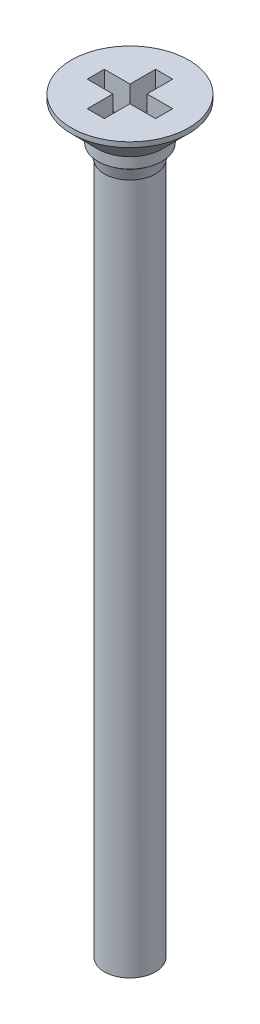
ISO-10303-21;
HEADER;
FILE_DESCRIPTION(('STEP AP214'),'2;1');
FILE_NAME('part.step','',(''),(''),'','','');
FILE_SCHEMA(('AUTOMOTIVE_DESIGN { 1 0 10303 214 1 1 1 1 }'));
ENDSEC;
DATA;
#1=APPLICATION_CONTEXT('core data for automotive mechanical design processes');
#2=APPLICATION_PROTOCOL_DEFINITION('international standard','automotive_design',2000,#1);
#3=PRODUCT_CONTEXT('',#1,'mechanical');
#4=PRODUCT('Part','Part','',(#3));
#5=PRODUCT_RELATED_PRODUCT_CATEGORY('part','',(#4));
#6=PRODUCT_DEFINITION_FORMATION('','',#4);
#7=PRODUCT_DEFINITION_CONTEXT('part definition',#1,'design');
#8=PRODUCT_DEFINITION('design','',#6,#7);
#9=PRODUCT_DEFINITION_SHAPE('','',#8);
#10=(LENGTH_UNIT() NAMED_UNIT(*) SI_UNIT(.MILLI.,.METRE.));
#11=(NAMED_UNIT(*) PLANE_ANGLE_UNIT() SI_UNIT($,.RADIAN.));
#12=(NAMED_UNIT(*) SI_UNIT($,.STERADIAN.) SOLID_ANGLE_UNIT());
#13=UNCERTAINTY_MEASURE_WITH_UNIT(LENGTH_MEASURE(1.E-05),#10,'distance_accuracy_value','');
#14=(GEOMETRIC_REPRESENTATION_CONTEXT(3) GLOBAL_UNCERTAINTY_ASSIGNED_CONTEXT((#13)) GLOBAL_UNIT_ASSIGNED_CONTEXT((#10,
#11,#12)) REPRESENTATION_CONTEXT('',''));
#15=CARTESIAN_POINT('',(0.,0.,0.));
#16=DIRECTION('',(0.,0.,1.));
#17=DIRECTION('',(1.,0.,0.));
#18=AXIS2_PLACEMENT_3D('',#15,#16,#17);
#19=CARTESIAN_POINT('',(0.,-2.65,-0.4));
#20=DIRECTION('',(0.,0.,-1.));
#21=DIRECTION('',(-1.,0.,0.));
#22=AXIS2_PLACEMENT_3D('',#19,#20,#21);
#23=PLANE('',#22);
#24=DIRECTION('',(0.,1.,0.));
#25=VECTOR('',#24,1.);
#26=CARTESIAN_POINT('',(0.4,-2.65,-0.4));
#27=LINE('',#26,#25);
#28=CARTESIAN_POINT('',(0.4,-2.1,-0.4));
#29=VERTEX_POINT('',#28);
#30=CARTESIAN_POINT('',(0.4,0.,-0.4));
#31=VERTEX_POINT('',#30);
#32=EDGE_CURVE('E215',#29,#31,#27,.T.);
#33=ORIENTED_EDGE('',*,*,#32,.F.);
#34=DIRECTION('',(1.,0.,0.));
#35=VECTOR('',#34,1.);
#36=CARTESIAN_POINT('',(-0.550000000000002,-2.1,-0.4));
#37=LINE('',#36,#35);
#38=CARTESIAN_POINT('',(0.550000000000002,-2.1,-0.4));
#39=VERTEX_POINT('',#38);
#40=EDGE_CURVE('E250',#29,#39,#37,.T.);
#41=ORIENTED_EDGE('',*,*,#40,.T.);
#42=DIRECTION('',(0.707106781186546,0.707106781186548,0.));
#43=VECTOR('',#42,1.);
#44=CARTESIAN_POINT('',(1.6,-1.05,-0.4));
#45=LINE('',#44,#43);
#46=CARTESIAN_POINT('',(1.6,-1.05,-0.4));
#47=VERTEX_POINT('',#46);
#48=EDGE_CURVE('E254',#39,#47,#45,.T.);
#49=ORIENTED_EDGE('',*,*,#48,.T.);
#50=DIRECTION('',(0.,1.,0.));
#51=VECTOR('',#50,1.);
#52=CARTESIAN_POINT('',(1.6,0.,-0.4));
#53=LINE('',#52,#51);
#54=CARTESIAN_POINT('',(1.6,0.,-0.4));
#55=VERTEX_POINT('',#54);
#56=EDGE_CURVE('E257',#47,#55,#53,.T.);
#57=ORIENTED_EDGE('',*,*,#56,.T.);
#58=DIRECTION('',(-1.,0.,0.));
#59=VECTOR('',#58,1.);
#60=CARTESIAN_POINT('',(1.6,0.,-0.4));
#61=LINE('',#60,#59);
#62=EDGE_CURVE('E261',#55,#31,#61,.T.);
#63=ORIENTED_EDGE('',*,*,#62,.T.);
#64=EDGE_LOOP('',(#33,#41,#49,#57,#63));
#65=FACE_BOUND('',#64,.T.);
#66=ADVANCED_FACE('F50',(#65),#23,.F.);
#67=CARTESIAN_POINT('',(0.,-2.65,0.4));
#68=DIRECTION('',(0.,0.,-1.));
#69=DIRECTION('',(-1.,0.,0.));
#70=AXIS2_PLACEMENT_3D('',#67,#68,#69);
#71=PLANE('',#70);
#72=DIRECTION('',(1.,0.,0.));
#73=VECTOR('',#72,1.);
#74=CARTESIAN_POINT('',(-0.550000000000002,-2.1,0.4));
#75=LINE('',#74,#73);
#76=CARTESIAN_POINT('',(0.4,-2.1,0.4));
#77=VERTEX_POINT('',#76);
#78=CARTESIAN_POINT('',(0.550000000000002,-2.1,0.4));
#79=VERTEX_POINT('',#78);
#80=EDGE_CURVE('E232',#77,#79,#75,.T.);
#81=ORIENTED_EDGE('',*,*,#80,.F.);
#82=DIRECTION('',(0.,1.,0.));
#83=VECTOR('',#82,1.);
#84=CARTESIAN_POINT('',(0.4,-2.65,0.4));
#85=LINE('',#84,#83);
#86=CARTESIAN_POINT('',(0.4,0.,0.4));
#87=VERTEX_POINT('',#86);
#88=EDGE_CURVE('E58',#77,#87,#85,.T.);
#89=ORIENTED_EDGE('',*,*,#88,.T.);
#90=DIRECTION('',(-1.,0.,0.));
#91=VECTOR('',#90,1.);
#92=CARTESIAN_POINT('',(1.6,0.,0.4));
#93=LINE('',#92,#91);
#94=CARTESIAN_POINT('',(1.6,0.,0.4));
#95=VERTEX_POINT('',#94);
#96=EDGE_CURVE('E241',#95,#87,#93,.T.);
#97=ORIENTED_EDGE('',*,*,#96,.F.);
#98=DIRECTION('',(0.,1.,0.));
#99=VECTOR('',#98,1.);
#100=CARTESIAN_POINT('',(1.6,0.,0.4));
#101=LINE('',#100,#99);
#102=CARTESIAN_POINT('',(1.6,-1.05,0.4));
#103=VERTEX_POINT('',#102);
#104=EDGE_CURVE('E238',#103,#95,#101,.T.);
#105=ORIENTED_EDGE('',*,*,#104,.F.);
#106=DIRECTION('',(0.707106781186546,0.707106781186548,0.));
#107=VECTOR('',#106,1.);
#108=CARTESIAN_POINT('',(1.6,-1.05,0.4));
#109=LINE('',#108,#107);
#110=EDGE_CURVE('E235',#79,#103,#109,.T.);
#111=ORIENTED_EDGE('',*,*,#110,.F.);
#112=EDGE_LOOP('',(#81,#89,#97,#105,#111));
#113=FACE_BOUND('',#112,.T.);
#114=ADVANCED_FACE('F304',(#113),#71,.T.);
#115=CARTESIAN_POINT('',(0.,0.,0.));
#116=DIRECTION('',(0.,-1.,0.));
#117=DIRECTION('',(1.,0.,0.));
#118=AXIS2_PLACEMENT_3D('',#115,#116,#117);
#119=PLANE('',#118);
#120=DIRECTION('',(1.,0.,0.));
#121=VECTOR('',#120,1.);
#122=CARTESIAN_POINT('',(-0.4,0.,1.6));
#123=LINE('',#122,#121);
#124=CARTESIAN_POINT('',(-0.4,0.,1.6));
#125=VERTEX_POINT('',#124);
#126=CARTESIAN_POINT('',(0.4,0.,1.6));
#127=VERTEX_POINT('',#126);
#128=EDGE_CURVE('E216',#125,#127,#123,.T.);
#129=ORIENTED_EDGE('',*,*,#128,.F.);
#130=DIRECTION('',(0.,0.,1.));
#131=VECTOR('',#130,1.);
#132=CARTESIAN_POINT('',(-0.4,0.,-1.6));
#133=LINE('',#132,#131);
#134=CARTESIAN_POINT('',(-0.4,0.,0.399999999999999));
#135=VERTEX_POINT('',#134);
#136=EDGE_CURVE('E209',#135,#125,#133,.T.);
#137=ORIENTED_EDGE('',*,*,#136,.F.);
#138=CARTESIAN_POINT('',(-1.6,0.,0.4));
#139=VERTEX_POINT('',#138);
#140=EDGE_CURVE('E240',#135,#139,#93,.T.);
#141=ORIENTED_EDGE('',*,*,#140,.T.);
#142=DIRECTION('',(0.,0.,1.));
#143=VECTOR('',#142,1.);
#144=CARTESIAN_POINT('',(-1.6,0.,-0.4));
#145=LINE('',#144,#143);
#146=CARTESIAN_POINT('',(-1.6,0.,-0.4));
#147=VERTEX_POINT('',#146);
#148=EDGE_CURVE('E271',#147,#139,#145,.T.);
#149=ORIENTED_EDGE('',*,*,#148,.F.);
#150=CARTESIAN_POINT('',(-0.4,0.,-0.4));
#151=VERTEX_POINT('',#150);
#152=EDGE_CURVE('E260',#151,#147,#61,.T.);
#153=ORIENTED_EDGE('',*,*,#152,.F.);
#154=CARTESIAN_POINT('',(-0.4,0.,-1.6));
#155=VERTEX_POINT('',#154);
#156=EDGE_CURVE('E210',#155,#151,#133,.T.);
#157=ORIENTED_EDGE('',*,*,#156,.F.);
#158=DIRECTION('',(1.,0.,0.));
#159=VECTOR('',#158,1.);
#160=CARTESIAN_POINT('',(-0.4,0.,-1.6));
#161=LINE('',#160,#159);
#162=CARTESIAN_POINT('',(0.4,0.,-1.6));
#163=VERTEX_POINT('',#162);
#164=EDGE_CURVE('E218',#155,#163,#161,.T.);
#165=ORIENTED_EDGE('',*,*,#164,.T.);
#166=DIRECTION('',(0.,0.,1.));
#167=VECTOR('',#166,1.);
#168=CARTESIAN_POINT('',(0.4,0.,-1.6));
#169=LINE('',#168,#167);
#170=EDGE_CURVE('E194',#163,#31,#169,.T.);
#171=ORIENTED_EDGE('',*,*,#170,.T.);
#172=ORIENTED_EDGE('',*,*,#62,.F.);
#173=DIRECTION('',(0.,0.,1.));
#174=VECTOR('',#173,1.);
#175=CARTESIAN_POINT('',(1.6,0.,-0.4));
#176=LINE('',#175,#174);
#177=EDGE_CURVE('E274',#55,#95,#176,.T.);
#178=ORIENTED_EDGE('',*,*,#177,.T.);
#179=ORIENTED_EDGE('',*,*,#96,.T.);
#180=EDGE_CURVE('E73',#87,#127,#169,.T.);
#181=ORIENTED_EDGE('',*,*,#180,.T.);
#182=EDGE_LOOP('',(#129,#137,#141,#149,#153,#157,#165,#171,#172,#178,#179,#181));
#183=FACE_BOUND('',#182,.T.);
#184=CARTESIAN_POINT('',(0.,0.,0.));
#185=DIRECTION('',(0.,1.,0.));
#186=DIRECTION('',(-1.,0.,0.));
#187=AXIS2_PLACEMENT_3D('',#184,#185,#186);
#188=CIRCLE('',#187,2.75);
#189=CARTESIAN_POINT('',(-2.75,0.,0.));
#190=VERTEX_POINT('',#189);
#191=EDGE_CURVE('E300',#190,#190,#188,.T.);
#192=ORIENTED_EDGE('',*,*,#191,.T.);
#193=EDGE_LOOP('',(#192));
#194=FACE_BOUND('',#193,.T.);
#195=ADVANCED_FACE('F52',(#183,#194),#119,.F.);
#196=CARTESIAN_POINT('',(0.,0.,0.));
#197=DIRECTION('',(0.,1.,0.));
#198=DIRECTION('',(-1.,0.,0.));
#199=AXIS2_PLACEMENT_3D('',#196,#197,#198);
#200=CYLINDRICAL_SURFACE('',#199,2.75);
#201=ORIENTED_EDGE('',*,*,#191,.F.);
#202=EDGE_LOOP('',(#201));
#203=FACE_BOUND('',#202,.T.);
#204=CARTESIAN_POINT('',(0.,-0.237500000000007,0.));
#205=DIRECTION('',(0.,1.,0.));
#206=DIRECTION('',(-1.,0.,0.));
#207=AXIS2_PLACEMENT_3D('',#204,#205,#206);
#208=CIRCLE('',#207,2.75);
#209=CARTESIAN_POINT('',(-2.75,-0.237500000000007,0.));
#210=VERTEX_POINT('',#209);
#211=EDGE_CURVE('E297',#210,#210,#208,.T.);
#212=ORIENTED_EDGE('',*,*,#211,.T.);
#213=EDGE_LOOP('',(#212));
#214=FACE_BOUND('',#213,.T.);
#215=ADVANCED_FACE('F409',(#203,#214),#200,.T.);
#216=CARTESIAN_POINT('',(0.,-1.4875,0.));
#217=DIRECTION('',(0.,1.,0.));
#218=DIRECTION('',(-1.,0.,0.));
#219=AXIS2_PLACEMENT_3D('',#216,#217,#218);
#220=CONICAL_SURFACE('',#219,1.5,0.78539816339745);
#221=ORIENTED_EDGE('',*,*,#211,.F.);
#222=EDGE_LOOP('',(#221));
#223=FACE_BOUND('',#222,.T.);
#224=CARTESIAN_POINT('',(0.,-1.4875,0.));
#225=DIRECTION('',(0.,1.,0.));
#226=DIRECTION('',(-1.,0.,0.));
#227=AXIS2_PLACEMENT_3D('',#224,#225,#226);
#228=CIRCLE('',#227,1.5);
#229=CARTESIAN_POINT('',(-1.5,-1.4875,0.));
#230=VERTEX_POINT('',#229);
#231=EDGE_CURVE('E294',#230,#230,#228,.T.);
#232=ORIENTED_EDGE('',*,*,#231,.T.);
#233=EDGE_LOOP('',(#232));
#234=FACE_BOUND('',#233,.T.);
#235=ADVANCED_FACE('F406',(#223,#234),#220,.T.);
#236=CARTESIAN_POINT('',(0.,0.,0.));
#237=DIRECTION('',(0.,1.,0.));
#238=DIRECTION('',(-1.,0.,0.));
#239=AXIS2_PLACEMENT_3D('',#236,#237,#238);
#240=CYLINDRICAL_SURFACE('',#239,1.5);
#241=ORIENTED_EDGE('',*,*,#231,.F.);
#242=EDGE_LOOP('',(#241));
#243=FACE_BOUND('',#242,.T.);
#244=CARTESIAN_POINT('',(0.,-1.9875,0.));
#245=DIRECTION('',(0.,1.,0.));
#246=DIRECTION('',(-1.,0.,0.));
#247=AXIS2_PLACEMENT_3D('',#244,#245,#246);
#248=CIRCLE('',#247,1.5);
#249=CARTESIAN_POINT('',(-1.5,-1.9875,0.));
#250=VERTEX_POINT('',#249);
#251=EDGE_CURVE('E291',#250,#250,#248,.T.);
#252=ORIENTED_EDGE('',*,*,#251,.T.);
#253=EDGE_LOOP('',(#252));
#254=FACE_BOUND('',#253,.T.);
#255=ADVANCED_FACE('F402',(#243,#254),#240,.T.);
#256=CARTESIAN_POINT('',(1.5,-1.9875,0.));
#257=DIRECTION('',(0.,1.,0.));
#258=DIRECTION('',(-1.,0.,0.));
#259=AXIS2_PLACEMENT_3D('',#256,#257,#258);
#260=PLANE('',#259);
#261=ORIENTED_EDGE('',*,*,#251,.F.);
#262=EDGE_LOOP('',(#261));
#263=FACE_BOUND('',#262,.T.);
#264=CARTESIAN_POINT('',(0.,-1.9875,0.));
#265=DIRECTION('',(0.,1.,0.));
#266=DIRECTION('',(-1.,0.,0.));
#267=AXIS2_PLACEMENT_3D('',#264,#265,#266);
#268=CIRCLE('',#267,1.3375);
#269=CARTESIAN_POINT('',(-1.3375,-1.9875,0.));
#270=VERTEX_POINT('',#269);
#271=EDGE_CURVE('E288',#270,#270,#268,.T.);
#272=ORIENTED_EDGE('',*,*,#271,.T.);
#273=EDGE_LOOP('',(#272));
#274=FACE_BOUND('',#273,.T.);
#275=ADVANCED_FACE('F398',(#263,#274),#260,.F.);
#276=CARTESIAN_POINT('',(0.,0.,0.));
#277=DIRECTION('',(0.,1.,0.));
#278=DIRECTION('',(-1.,0.,0.));
#279=AXIS2_PLACEMENT_3D('',#276,#277,#278);
#280=CYLINDRICAL_SURFACE('',#279,1.3375);
#281=ORIENTED_EDGE('',*,*,#271,.F.);
#282=EDGE_LOOP('',(#281));
#283=FACE_BOUND('',#282,.T.);
#284=CARTESIAN_POINT('',(0.,-2.11258468371008,0.));
#285=DIRECTION('',(0.,1.,0.));
#286=DIRECTION('',(-1.,0.,0.));
#287=AXIS2_PLACEMENT_3D('',#284,#285,#286);
#288=CIRCLE('',#287,1.3375);
#289=CARTESIAN_POINT('',(-1.3375,-2.11258468371008,0.));
#290=VERTEX_POINT('',#289);
#291=EDGE_CURVE('E285',#290,#290,#288,.T.);
#292=ORIENTED_EDGE('',*,*,#291,.T.);
#293=EDGE_LOOP('',(#292));
#294=FACE_BOUND('',#293,.T.);
#295=ADVANCED_FACE('F394',(#283,#294),#280,.T.);
#296=CARTESIAN_POINT('',(0.,-2.65,0.));
#297=DIRECTION('',(0.,1.,0.));
#298=DIRECTION('',(-1.,0.,0.));
#299=AXIS2_PLACEMENT_3D('',#296,#297,#298);
#300=CONICAL_SURFACE('',#299,1.1935,0.26179938779915);
#301=ORIENTED_EDGE('',*,*,#291,.F.);
#302=EDGE_LOOP('',(#301));
#303=FACE_BOUND('',#302,.T.);
#304=CARTESIAN_POINT('',(0.,-2.65,0.));
#305=DIRECTION('',(0.,1.,0.));
#306=DIRECTION('',(-1.,0.,0.));
#307=AXIS2_PLACEMENT_3D('',#304,#305,#306);
#308=CIRCLE('',#307,1.1935);
#309=CARTESIAN_POINT('',(-1.1935,-2.65,0.));
#310=VERTEX_POINT('',#309);
#311=EDGE_CURVE('E270',#310,#310,#308,.T.);
#312=ORIENTED_EDGE('',*,*,#311,.T.);
#313=EDGE_LOOP('',(#312));
#314=FACE_BOUND('',#313,.T.);
#315=ADVANCED_FACE('F390',(#303,#314),#300,.T.);
#316=CARTESIAN_POINT('',(0.,0.,0.));
#317=DIRECTION('',(0.,1.,0.));
#318=DIRECTION('',(-1.,0.,0.));
#319=AXIS2_PLACEMENT_3D('',#316,#317,#318);
#320=CYLINDRICAL_SURFACE('',#319,1.1935);
#321=ORIENTED_EDGE('',*,*,#311,.F.);
#322=EDGE_LOOP('',(#321));
#323=FACE_BOUND('',#322,.T.);
#324=CARTESIAN_POINT('',(0.,-35.,0.));
#325=DIRECTION('',(0.,-1.,0.));
#326=DIRECTION('',(1.,0.,0.));
#327=AXIS2_PLACEMENT_3D('',#324,#325,#326);
#328=CIRCLE('',#327,1.1935);
#329=CARTESIAN_POINT('',(1.1935,-35.,0.));
#330=VERTEX_POINT('',#329);
#331=EDGE_CURVE('E185',#330,#330,#328,.T.);
#332=ORIENTED_EDGE('',*,*,#331,.F.);
#333=EDGE_LOOP('',(#332));
#334=FACE_BOUND('',#333,.T.);
#335=ADVANCED_FACE('F387',(#323,#334),#320,.T.);
#336=CARTESIAN_POINT('',(-1.6,-1.05,-0.4));
#337=DIRECTION('',(-0.707106781186548,-0.707106781186546,0.));
#338=DIRECTION('',(0.707106781186547,-0.707106781186548,0.));
#339=AXIS2_PLACEMENT_3D('',#336,#337,#338);
#340=PLANE('',#339);
#341=DIRECTION('',(0.,0.,1.));
#342=VECTOR('',#341,1.);
#343=CARTESIAN_POINT('',(-0.550000000000002,-2.1,-0.4));
#344=LINE('',#343,#342);
#345=CARTESIAN_POINT('',(-0.550000000000002,-2.1,-0.4));
#346=VERTEX_POINT('',#345);
#347=CARTESIAN_POINT('',(-0.550000000000002,-2.1,0.4));
#348=VERTEX_POINT('',#347);
#349=EDGE_CURVE('E267',#346,#348,#344,.T.);
#350=ORIENTED_EDGE('',*,*,#349,.F.);
#351=DIRECTION('',(0.707106781186546,-0.707106781186548,0.));
#352=VECTOR('',#351,1.);
#353=CARTESIAN_POINT('',(-1.6,-1.05,-0.4));
#354=LINE('',#353,#352);
#355=CARTESIAN_POINT('',(-1.6,-1.05,-0.4));
#356=VERTEX_POINT('',#355);
#357=EDGE_CURVE('E247',#356,#346,#354,.T.);
#358=ORIENTED_EDGE('',*,*,#357,.F.);
#359=DIRECTION('',(0.,0.,1.));
#360=VECTOR('',#359,1.);
#361=CARTESIAN_POINT('',(-1.6,-1.05,-0.4));
#362=LINE('',#361,#360);
#363=CARTESIAN_POINT('',(-1.6,-1.05,0.4));
#364=VERTEX_POINT('',#363);
#365=EDGE_CURVE('E268',#356,#364,#362,.T.);
#366=ORIENTED_EDGE('',*,*,#365,.T.);
#367=DIRECTION('',(0.707106781186546,-0.707106781186548,0.));
#368=VECTOR('',#367,1.);
#369=CARTESIAN_POINT('',(-1.6,-1.05,0.4));
#370=LINE('',#369,#368);
#371=EDGE_CURVE('E229',#364,#348,#370,.T.);
#372=ORIENTED_EDGE('',*,*,#371,.T.);
#373=EDGE_LOOP('',(#350,#358,#366,#372));
#374=FACE_BOUND('',#373,.T.);
#375=ADVANCED_FACE('F341',(#374),#340,.F.);
#376=CARTESIAN_POINT('',(-1.6,0.,-0.4));
#377=DIRECTION('',(-1.,0.,0.));
#378=DIRECTION('',(0.,0.,1.));
#379=AXIS2_PLACEMENT_3D('',#376,#377,#378);
#380=PLANE('',#379);
#381=ORIENTED_EDGE('',*,*,#365,.F.);
#382=DIRECTION('',(0.,-1.,0.));
#383=VECTOR('',#382,1.);
#384=CARTESIAN_POINT('',(-1.6,0.,-0.4));
#385=LINE('',#384,#383);
#386=EDGE_CURVE('E264',#147,#356,#385,.T.);
#387=ORIENTED_EDGE('',*,*,#386,.F.);
#388=ORIENTED_EDGE('',*,*,#148,.T.);
#389=DIRECTION('',(0.,-1.,0.));
#390=VECTOR('',#389,1.);
#391=CARTESIAN_POINT('',(-1.6,0.,0.4));
#392=LINE('',#391,#390);
#393=EDGE_CURVE('E244',#139,#364,#392,.T.);
#394=ORIENTED_EDGE('',*,*,#393,.T.);
#395=EDGE_LOOP('',(#381,#387,#388,#394));
#396=FACE_BOUND('',#395,.T.);
#397=ADVANCED_FACE('F386',(#396),#380,.F.);
#398=CARTESIAN_POINT('',(1.6,0.,-0.4));
#399=DIRECTION('',(1.,0.,0.));
#400=DIRECTION('',(0.,0.,-1.));
#401=AXIS2_PLACEMENT_3D('',#398,#399,#400);
#402=PLANE('',#401);
#403=ORIENTED_EDGE('',*,*,#177,.F.);
#404=ORIENTED_EDGE('',*,*,#56,.F.);
#405=DIRECTION('',(0.,0.,1.));
#406=VECTOR('',#405,1.);
#407=CARTESIAN_POINT('',(1.6,-1.05,-0.4));
#408=LINE('',#407,#406);
#409=EDGE_CURVE('E277',#47,#103,#408,.T.);
#410=ORIENTED_EDGE('',*,*,#409,.T.);
#411=ORIENTED_EDGE('',*,*,#104,.T.);
#412=EDGE_LOOP('',(#403,#404,#410,#411));
#413=FACE_BOUND('',#412,.T.);
#414=ADVANCED_FACE('F313',(#413),#402,.F.);
#415=CARTESIAN_POINT('',(1.6,-1.05,-0.4));
#416=DIRECTION('',(0.707106781186548,-0.707106781186546,0.));
#417=DIRECTION('',(0.707106781186547,0.707106781186548,0.));
#418=AXIS2_PLACEMENT_3D('',#415,#416,#417);
#419=PLANE('',#418);
#420=ORIENTED_EDGE('',*,*,#409,.F.);
#421=ORIENTED_EDGE('',*,*,#48,.F.);
#422=DIRECTION('',(0.,0.,1.));
#423=VECTOR('',#422,1.);
#424=CARTESIAN_POINT('',(0.550000000000002,-2.1,-0.4));
#425=LINE('',#424,#423);
#426=EDGE_CURVE('E279',#39,#79,#425,.T.);
#427=ORIENTED_EDGE('',*,*,#426,.T.);
#428=ORIENTED_EDGE('',*,*,#110,.T.);
#429=EDGE_LOOP('',(#420,#421,#427,#428));
#430=FACE_BOUND('',#429,.T.);
#431=ADVANCED_FACE('F319',(#430),#419,.F.);
#432=CARTESIAN_POINT('',(-0.550000000000002,-2.1,-0.4));
#433=DIRECTION('',(0.,-1.,0.));
#434=DIRECTION('',(0.,0.,-1.));
#435=AXIS2_PLACEMENT_3D('',#432,#433,#434);
#436=PLANE('',#435);
#437=CARTESIAN_POINT('',(-0.4,-2.1,0.4));
#438=VERTEX_POINT('',#437);
#439=EDGE_CURVE('E233',#348,#438,#75,.T.);
#440=ORIENTED_EDGE('',*,*,#439,.T.);
#441=DIRECTION('',(0.,0.,-1.));
#442=VECTOR('',#441,1.);
#443=CARTESIAN_POINT('',(-0.4,-2.1,0.550000000000002));
#444=LINE('',#443,#442);
#445=CARTESIAN_POINT('',(-0.4,-2.1,0.550000000000002));
#446=VERTEX_POINT('',#445);
#447=EDGE_CURVE('E169',#446,#438,#444,.T.);
#448=ORIENTED_EDGE('',*,*,#447,.F.);
#449=DIRECTION('',(1.,0.,0.));
#450=VECTOR('',#449,1.);
#451=CARTESIAN_POINT('',(-0.4,-2.1,0.550000000000002));
#452=LINE('',#451,#450);
#453=CARTESIAN_POINT('',(0.4,-2.1,0.550000000000002));
#454=VERTEX_POINT('',#453);
#455=EDGE_CURVE('E163',#446,#454,#452,.T.);
#456=ORIENTED_EDGE('',*,*,#455,.T.);
#457=DIRECTION('',(0.,0.,-1.));
#458=VECTOR('',#457,1.);
#459=CARTESIAN_POINT('',(0.4,-2.1,0.550000000000002));
#460=LINE('',#459,#458);
#461=EDGE_CURVE('E167',#454,#77,#460,.T.);
#462=ORIENTED_EDGE('',*,*,#461,.T.);
#463=ORIENTED_EDGE('',*,*,#80,.T.);
#464=ORIENTED_EDGE('',*,*,#426,.F.);
#465=ORIENTED_EDGE('',*,*,#40,.F.);
#466=CARTESIAN_POINT('',(0.4,-2.1,-0.550000000000002));
#467=VERTEX_POINT('',#466);
#468=EDGE_CURVE('E65',#29,#467,#460,.T.);
#469=ORIENTED_EDGE('',*,*,#468,.T.);
#470=DIRECTION('',(1.,0.,0.));
#471=VECTOR('',#470,1.);
#472=CARTESIAN_POINT('',(-0.4,-2.1,-0.550000000000002));
#473=LINE('',#472,#471);
#474=CARTESIAN_POINT('',(-0.4,-2.1,-0.550000000000002));
#475=VERTEX_POINT('',#474);
#476=EDGE_CURVE('E174',#475,#467,#473,.T.);
#477=ORIENTED_EDGE('',*,*,#476,.F.);
#478=CARTESIAN_POINT('',(-0.4,-2.1,-0.4));
#479=VERTEX_POINT('',#478);
#480=EDGE_CURVE('E201',#479,#475,#444,.T.);
#481=ORIENTED_EDGE('',*,*,#480,.F.);
#482=EDGE_CURVE('E251',#346,#479,#37,.T.);
#483=ORIENTED_EDGE('',*,*,#482,.F.);
#484=ORIENTED_EDGE('',*,*,#349,.T.);
#485=EDGE_LOOP('',(#440,#448,#456,#462,#463,#464,#465,#469,#477,#481,#483,#484));
#486=FACE_BOUND('',#485,.T.);
#487=ADVANCED_FACE('F166',(#486),#436,.F.);
#488=ORIENTED_EDGE('',*,*,#482,.T.);
#489=DIRECTION('',(0.,1.,0.));
#490=VECTOR('',#489,1.);
#491=CARTESIAN_POINT('',(-0.4,-2.65,-0.4));
#492=LINE('',#491,#490);
#493=EDGE_CURVE('E226',#479,#151,#492,.T.);
#494=ORIENTED_EDGE('',*,*,#493,.T.);
#495=ORIENTED_EDGE('',*,*,#152,.T.);
#496=ORIENTED_EDGE('',*,*,#386,.T.);
#497=ORIENTED_EDGE('',*,*,#357,.T.);
#498=EDGE_LOOP('',(#488,#494,#495,#496,#497));
#499=FACE_BOUND('',#498,.T.);
#500=ADVANCED_FACE('F336',(#499),#23,.F.);
#501=DIRECTION('',(0.,1.,0.));
#502=VECTOR('',#501,1.);
#503=CARTESIAN_POINT('',(-0.4,-2.65,0.4));
#504=LINE('',#503,#502);
#505=EDGE_CURVE('E13',#438,#135,#504,.T.);
#506=ORIENTED_EDGE('',*,*,#505,.F.);
#507=ORIENTED_EDGE('',*,*,#439,.F.);
#508=ORIENTED_EDGE('',*,*,#371,.F.);
#509=ORIENTED_EDGE('',*,*,#393,.F.);
#510=ORIENTED_EDGE('',*,*,#140,.F.);
#511=EDGE_LOOP('',(#506,#507,#508,#509,#510));
#512=FACE_BOUND('',#511,.T.);
#513=ADVANCED_FACE('F346',(#512),#71,.T.);
#514=CARTESIAN_POINT('',(-0.4,-1.05,1.6));
#515=DIRECTION('',(0.,-0.707106781186546,0.707106781186548));
#516=DIRECTION('',(0.,-0.707106781186548,-0.707106781186547));
#517=AXIS2_PLACEMENT_3D('',#514,#515,#516);
#518=PLANE('',#517);
#519=ORIENTED_EDGE('',*,*,#455,.F.);
#520=DIRECTION('',(0.,-0.707106781186548,-0.707106781186546));
#521=VECTOR('',#520,1.);
#522=CARTESIAN_POINT('',(-0.4,-1.05,1.6));
#523=LINE('',#522,#521);
#524=CARTESIAN_POINT('',(-0.4,-1.05,1.6));
#525=VERTEX_POINT('',#524);
#526=EDGE_CURVE('E199',#525,#446,#523,.T.);
#527=ORIENTED_EDGE('',*,*,#526,.F.);
#528=DIRECTION('',(1.,0.,0.));
#529=VECTOR('',#528,1.);
#530=CARTESIAN_POINT('',(-0.4,-1.05,1.6));
#531=LINE('',#530,#529);
#532=CARTESIAN_POINT('',(0.4,-1.05,1.6));
#533=VERTEX_POINT('',#532);
#534=EDGE_CURVE('E183',#525,#533,#531,.T.);
#535=ORIENTED_EDGE('',*,*,#534,.T.);
#536=DIRECTION('',(0.,-0.707106781186548,-0.707106781186546));
#537=VECTOR('',#536,1.);
#538=CARTESIAN_POINT('',(0.4,-1.05,1.6));
#539=LINE('',#538,#537);
#540=EDGE_CURVE('E179',#533,#454,#539,.T.);
#541=ORIENTED_EDGE('',*,*,#540,.T.);
#542=EDGE_LOOP('',(#519,#527,#535,#541));
#543=FACE_BOUND('',#542,.T.);
#544=ADVANCED_FACE('F182',(#543),#518,.F.);
#545=CARTESIAN_POINT('',(-0.4,-2.65,0.));
#546=DIRECTION('',(-1.,0.,0.));
#547=DIRECTION('',(0.,0.,1.));
#548=AXIS2_PLACEMENT_3D('',#545,#546,#547);
#549=PLANE('',#548);
#550=ORIENTED_EDGE('',*,*,#505,.T.);
#551=ORIENTED_EDGE('',*,*,#136,.T.);
#552=DIRECTION('',(0.,-1.,0.));
#553=VECTOR('',#552,1.);
#554=CARTESIAN_POINT('',(-0.4,0.,1.6));
#555=LINE('',#554,#553);
#556=EDGE_CURVE('E175',#125,#525,#555,.T.);
#557=ORIENTED_EDGE('',*,*,#556,.T.);
#558=ORIENTED_EDGE('',*,*,#526,.T.);
#559=ORIENTED_EDGE('',*,*,#447,.T.);
#560=EDGE_LOOP('',(#550,#551,#557,#558,#559));
#561=FACE_BOUND('',#560,.T.);
#562=ADVANCED_FACE('F351',(#561),#549,.F.);
#563=CARTESIAN_POINT('',(0.4,-2.65,0.));
#564=DIRECTION('',(-1.,0.,0.));
#565=DIRECTION('',(0.,0.,1.));
#566=AXIS2_PLACEMENT_3D('',#563,#564,#565);
#567=PLANE('',#566);
#568=ORIENTED_EDGE('',*,*,#461,.F.);
#569=ORIENTED_EDGE('',*,*,#540,.F.);
#570=DIRECTION('',(0.,-1.,0.));
#571=VECTOR('',#570,1.);
#572=CARTESIAN_POINT('',(0.4,0.,1.6));
#573=LINE('',#572,#571);
#574=EDGE_CURVE('E197',#127,#533,#573,.T.);
#575=ORIENTED_EDGE('',*,*,#574,.F.);
#576=ORIENTED_EDGE('',*,*,#180,.F.);
#577=ORIENTED_EDGE('',*,*,#88,.F.);
#578=EDGE_LOOP('',(#568,#569,#575,#576,#577));
#579=FACE_BOUND('',#578,.T.);
#580=ADVANCED_FACE('F178',(#579),#567,.T.);
#581=CARTESIAN_POINT('',(-0.4,0.,1.6));
#582=DIRECTION('',(0.,0.,1.));
#583=DIRECTION('',(1.,0.,0.));
#584=AXIS2_PLACEMENT_3D('',#581,#582,#583);
#585=PLANE('',#584);
#586=ORIENTED_EDGE('',*,*,#534,.F.);
#587=ORIENTED_EDGE('',*,*,#556,.F.);
#588=ORIENTED_EDGE('',*,*,#128,.T.);
#589=ORIENTED_EDGE('',*,*,#574,.T.);
#590=EDGE_LOOP('',(#586,#587,#588,#589));
#591=FACE_BOUND('',#590,.T.);
#592=ADVANCED_FACE('F355',(#591),#585,.F.);
#593=ORIENTED_EDGE('',*,*,#480,.T.);
#594=DIRECTION('',(0.,0.707106781186548,-0.707106781186546));
#595=VECTOR('',#594,1.);
#596=CARTESIAN_POINT('',(-0.4,-1.05,-1.6));
#597=LINE('',#596,#595);
#598=CARTESIAN_POINT('',(-0.4,-1.05,-1.6));
#599=VERTEX_POINT('',#598);
#600=EDGE_CURVE('E203',#475,#599,#597,.T.);
#601=ORIENTED_EDGE('',*,*,#600,.T.);
#602=DIRECTION('',(0.,1.,0.));
#603=VECTOR('',#602,1.);
#604=CARTESIAN_POINT('',(-0.4,0.,-1.6));
#605=LINE('',#604,#603);
#606=EDGE_CURVE('E206',#599,#155,#605,.T.);
#607=ORIENTED_EDGE('',*,*,#606,.T.);
#608=ORIENTED_EDGE('',*,*,#156,.T.);
#609=ORIENTED_EDGE('',*,*,#493,.F.);
#610=EDGE_LOOP('',(#593,#601,#607,#608,#609));
#611=FACE_BOUND('',#610,.T.);
#612=ADVANCED_FACE('F333',(#611),#549,.F.);
#613=ORIENTED_EDGE('',*,*,#32,.T.);
#614=ORIENTED_EDGE('',*,*,#170,.F.);
#615=DIRECTION('',(0.,1.,0.));
#616=VECTOR('',#615,1.);
#617=CARTESIAN_POINT('',(0.4,0.,-1.6));
#618=LINE('',#617,#616);
#619=CARTESIAN_POINT('',(0.4,-1.05,-1.6));
#620=VERTEX_POINT('',#619);
#621=EDGE_CURVE('E192',#620,#163,#618,.T.);
#622=ORIENTED_EDGE('',*,*,#621,.F.);
#623=DIRECTION('',(0.,0.707106781186548,-0.707106781186546));
#624=VECTOR('',#623,1.);
#625=CARTESIAN_POINT('',(0.4,-1.05,-1.6));
#626=LINE('',#625,#624);
#627=EDGE_CURVE('E180',#467,#620,#626,.T.);
#628=ORIENTED_EDGE('',*,*,#627,.F.);
#629=ORIENTED_EDGE('',*,*,#468,.F.);
#630=EDGE_LOOP('',(#613,#614,#622,#628,#629));
#631=FACE_BOUND('',#630,.T.);
#632=ADVANCED_FACE('F326',(#631),#567,.T.);
#633=CARTESIAN_POINT('',(-0.4,0.,-1.6));
#634=DIRECTION('',(0.,0.,-1.));
#635=DIRECTION('',(-1.,0.,0.));
#636=AXIS2_PLACEMENT_3D('',#633,#634,#635);
#637=PLANE('',#636);
#638=ORIENTED_EDGE('',*,*,#164,.F.);
#639=ORIENTED_EDGE('',*,*,#606,.F.);
#640=DIRECTION('',(1.,0.,0.));
#641=VECTOR('',#640,1.);
#642=CARTESIAN_POINT('',(-0.4,-1.05,-1.6));
#643=LINE('',#642,#641);
#644=EDGE_CURVE('E221',#599,#620,#643,.T.);
#645=ORIENTED_EDGE('',*,*,#644,.T.);
#646=ORIENTED_EDGE('',*,*,#621,.T.);
#647=EDGE_LOOP('',(#638,#639,#645,#646));
#648=FACE_BOUND('',#647,.T.);
#649=ADVANCED_FACE('F329',(#648),#637,.F.);
#650=CARTESIAN_POINT('',(-0.4,-1.05,-1.6));
#651=DIRECTION('',(0.,-0.707106781186546,-0.707106781186548));
#652=DIRECTION('',(0.,0.707106781186548,-0.707106781186547));
#653=AXIS2_PLACEMENT_3D('',#650,#651,#652);
#654=PLANE('',#653);
#655=ORIENTED_EDGE('',*,*,#644,.F.);
#656=ORIENTED_EDGE('',*,*,#600,.F.);
#657=ORIENTED_EDGE('',*,*,#476,.T.);
#658=ORIENTED_EDGE('',*,*,#627,.T.);
#659=EDGE_LOOP('',(#655,#656,#657,#658));
#660=FACE_BOUND('',#659,.T.);
#661=ADVANCED_FACE('F324',(#660),#654,.F.);
#662=CARTESIAN_POINT('',(0.,-35.,0.));
#663=DIRECTION('',(0.,-1.,0.));
#664=DIRECTION('',(1.,0.,0.));
#665=AXIS2_PLACEMENT_3D('',#662,#663,#664);
#666=PLANE('',#665);
#667=ORIENTED_EDGE('',*,*,#331,.T.);
#668=EDGE_LOOP('',(#667));
#669=FACE_BOUND('',#668,.T.);
#670=ADVANCED_FACE('F432',(#669),#666,.T.);
#671=CLOSED_SHELL('',(#66,#114,#195,#215,#235,#255,#275,#295,#315,#335,#375,#397,#414,#431,#487,
#500,#513,#544,#562,#580,#592,#612,#632,#649,#661,#670));
#672=MANIFOLD_SOLID_BREP('B2',#671);
#673=ADVANCED_BREP_SHAPE_REPRESENTATION('',(#18,#672),#14);
#674=SHAPE_DEFINITION_REPRESENTATION(#9,#673);
ENDSEC;
END-ISO-10303-21;
